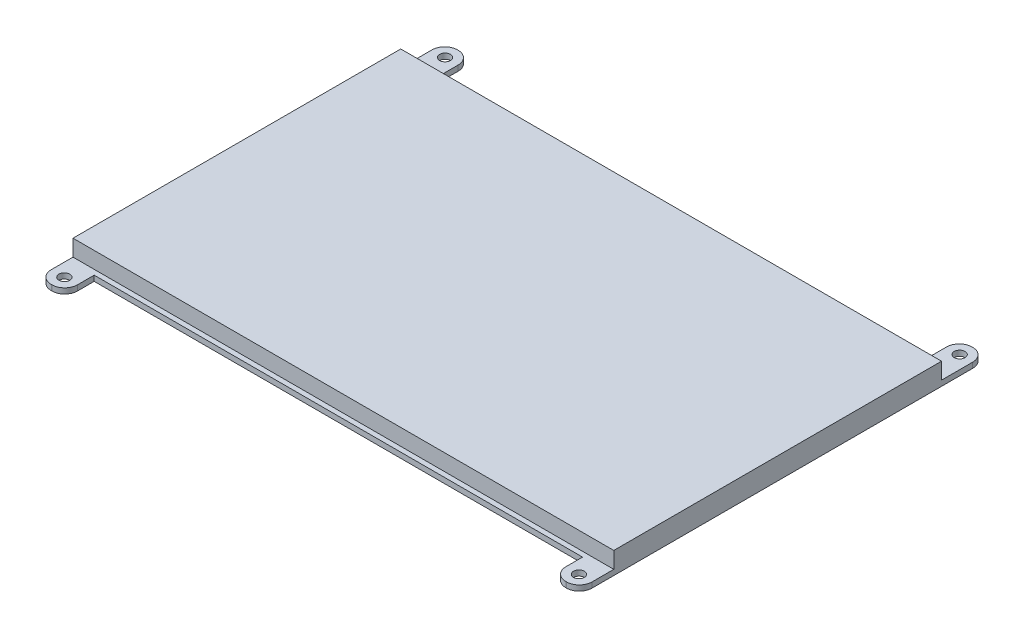
ISO-10303-21;
HEADER;
FILE_DESCRIPTION(('STEP AP214'),'2;1');
FILE_NAME('part.step','',(''),(''),'','','');
FILE_SCHEMA(('AUTOMOTIVE_DESIGN { 1 0 10303 214 1 1 1 1 }'));
ENDSEC;
DATA;
#1=APPLICATION_CONTEXT('core data for automotive mechanical design processes');
#2=APPLICATION_PROTOCOL_DEFINITION('international standard','automotive_design',2000,#1);
#3=PRODUCT_CONTEXT('',#1,'mechanical');
#4=PRODUCT('Part','Part','',(#3));
#5=PRODUCT_RELATED_PRODUCT_CATEGORY('part','',(#4));
#6=PRODUCT_DEFINITION_FORMATION('','',#4);
#7=PRODUCT_DEFINITION_CONTEXT('part definition',#1,'design');
#8=PRODUCT_DEFINITION('design','',#6,#7);
#9=PRODUCT_DEFINITION_SHAPE('','',#8);
#10=(LENGTH_UNIT() NAMED_UNIT(*) SI_UNIT(.MILLI.,.METRE.));
#11=(NAMED_UNIT(*) PLANE_ANGLE_UNIT() SI_UNIT($,.RADIAN.));
#12=(NAMED_UNIT(*) SI_UNIT($,.STERADIAN.) SOLID_ANGLE_UNIT());
#13=UNCERTAINTY_MEASURE_WITH_UNIT(LENGTH_MEASURE(1.E-05),#10,'distance_accuracy_value','');
#14=(GEOMETRIC_REPRESENTATION_CONTEXT(3) GLOBAL_UNCERTAINTY_ASSIGNED_CONTEXT((#13)) GLOBAL_UNIT_ASSIGNED_CONTEXT((#10,
#11,#12)) REPRESENTATION_CONTEXT('',''));
#15=CARTESIAN_POINT('',(0.,0.,0.));
#16=DIRECTION('',(0.,0.,1.));
#17=DIRECTION('',(1.,0.,0.));
#18=AXIS2_PLACEMENT_3D('',#15,#16,#17);
#19=CARTESIAN_POINT('',(-73.7209302325582,5.,-49.9999999999972));
#20=DIRECTION('',(1.,0.,0.));
#21=DIRECTION('',(0.,0.,-1.));
#22=AXIS2_PLACEMENT_3D('',#19,#20,#21);
#23=PLANE('',#22);
#24=DIRECTION('',(0.,-1.,0.));
#25=VECTOR('',#24,1.);
#26=CARTESIAN_POINT('',(-73.7209302325582,5.,-49.9999999999972));
#27=LINE('',#26,#25);
#28=CARTESIAN_POINT('',(-73.7209302325582,5.,-49.9999999999972));
#29=VERTEX_POINT('',#28);
#30=CARTESIAN_POINT('',(-73.7209302325581,0.,-49.9999999999972));
#31=VERTEX_POINT('',#30);
#32=EDGE_CURVE('E247',#29,#31,#27,.T.);
#33=ORIENTED_EDGE('',*,*,#32,.T.);
#34=DIRECTION('',(0.,0.,1.));
#35=VECTOR('',#34,1.);
#36=CARTESIAN_POINT('',(-73.7209302325581,0.,0.));
#37=LINE('',#36,#35);
#38=CARTESIAN_POINT('',(-73.7209302325582,0.,-59.5199999999971));
#39=VERTEX_POINT('',#38);
#40=EDGE_CURVE('E273',#39,#31,#37,.T.);
#41=ORIENTED_EDGE('',*,*,#40,.F.);
#42=DIRECTION('',(0.,1.,0.));
#43=VECTOR('',#42,1.);
#44=CARTESIAN_POINT('',(-73.7209302325582,-1.65,-59.5199999999971));
#45=LINE('',#44,#43);
#46=CARTESIAN_POINT('',(-73.7209302325582,-1.65,-59.5199999999971));
#47=VERTEX_POINT('',#46);
#48=EDGE_CURVE('E335',#47,#39,#45,.T.);
#49=ORIENTED_EDGE('',*,*,#48,.F.);
#50=DIRECTION('',(0.,0.,1.));
#51=VECTOR('',#50,1.);
#52=CARTESIAN_POINT('',(-73.7209302325581,-1.65,0.));
#53=LINE('',#52,#51);
#54=CARTESIAN_POINT('',(-73.7209302325581,-1.65,56.6300000000028));
#55=VERTEX_POINT('',#54);
#56=EDGE_CURVE('E419',#47,#55,#53,.T.);
#57=ORIENTED_EDGE('',*,*,#56,.T.);
#58=DIRECTION('',(0.,1.,0.));
#59=VECTOR('',#58,1.);
#60=CARTESIAN_POINT('',(-73.7209302325581,-1.65,56.6300000000028));
#61=LINE('',#60,#59);
#62=CARTESIAN_POINT('',(-73.7209302325581,0.,56.6300000000028));
#63=VERTEX_POINT('',#62);
#64=EDGE_CURVE('E271',#55,#63,#61,.T.);
#65=ORIENTED_EDGE('',*,*,#64,.T.);
#66=CARTESIAN_POINT('',(-73.7209302325581,0.,50.0000000000028));
#67=VERTEX_POINT('',#66);
#68=EDGE_CURVE('E266',#67,#63,#37,.T.);
#69=ORIENTED_EDGE('',*,*,#68,.F.);
#70=DIRECTION('',(0.,-1.,0.));
#71=VECTOR('',#70,1.);
#72=CARTESIAN_POINT('',(-73.7209302325581,5.,50.0000000000028));
#73=LINE('',#72,#71);
#74=CARTESIAN_POINT('',(-73.7209302325581,5.,50.0000000000028));
#75=VERTEX_POINT('',#74);
#76=EDGE_CURVE('E11',#75,#67,#73,.T.);
#77=ORIENTED_EDGE('',*,*,#76,.F.);
#78=DIRECTION('',(0.,0.,1.));
#79=VECTOR('',#78,1.);
#80=CARTESIAN_POINT('',(-73.7209302325582,5.,-49.9999999999972));
#81=LINE('',#80,#79);
#82=EDGE_CURVE('E241',#29,#75,#81,.T.);
#83=ORIENTED_EDGE('',*,*,#82,.F.);
#84=EDGE_LOOP('',(#33,#41,#49,#57,#65,#69,#77,#83));
#85=FACE_BOUND('',#84,.T.);
#86=ADVANCED_FACE('F49',(#85),#23,.F.);
#87=CARTESIAN_POINT('',(-73.7209302325581,5.,50.0000000000028));
#88=DIRECTION('',(0.,0.,-1.));
#89=DIRECTION('',(-1.,0.,0.));
#90=AXIS2_PLACEMENT_3D('',#87,#88,#89);
#91=PLANE('',#90);
#92=DIRECTION('',(1.,0.,0.));
#93=VECTOR('',#92,1.);
#94=CARTESIAN_POINT('',(-73.7209302325581,0.,50.0000000000028));
#95=LINE('',#94,#93);
#96=CARTESIAN_POINT('',(91.2790697674419,0.,50.0000000000028));
#97=VERTEX_POINT('',#96);
#98=EDGE_CURVE('E232',#67,#97,#95,.T.);
#99=ORIENTED_EDGE('',*,*,#98,.T.);
#100=DIRECTION('',(0.,-1.,0.));
#101=VECTOR('',#100,1.);
#102=CARTESIAN_POINT('',(91.2790697674419,5.,50.0000000000028));
#103=LINE('',#102,#101);
#104=CARTESIAN_POINT('',(91.2790697674419,5.,50.0000000000028));
#105=VERTEX_POINT('',#104);
#106=EDGE_CURVE('E57',#105,#97,#103,.T.);
#107=ORIENTED_EDGE('',*,*,#106,.F.);
#108=DIRECTION('',(1.,0.,0.));
#109=VECTOR('',#108,1.);
#110=CARTESIAN_POINT('',(-73.7209302325581,5.,50.0000000000028));
#111=LINE('',#110,#109);
#112=EDGE_CURVE('E243',#75,#105,#111,.T.);
#113=ORIENTED_EDGE('',*,*,#112,.F.);
#114=ORIENTED_EDGE('',*,*,#76,.T.);
#115=EDGE_LOOP('',(#99,#107,#113,#114));
#116=FACE_BOUND('',#115,.T.);
#117=ADVANCED_FACE('F259',(#116),#91,.F.);
#118=CARTESIAN_POINT('',(91.2790697674419,5.,-49.9999999999972));
#119=DIRECTION('',(-1.,0.,0.));
#120=DIRECTION('',(0.,0.,1.));
#121=AXIS2_PLACEMENT_3D('',#118,#119,#120);
#122=PLANE('',#121);
#123=ORIENTED_EDGE('',*,*,#106,.T.);
#124=DIRECTION('',(0.,0.,1.));
#125=VECTOR('',#124,1.);
#126=CARTESIAN_POINT('',(91.2790697674419,0.,0.));
#127=LINE('',#126,#125);
#128=CARTESIAN_POINT('',(91.2790697674419,0.,56.6300000000028));
#129=VERTEX_POINT('',#128);
#130=EDGE_CURVE('E230',#97,#129,#127,.T.);
#131=ORIENTED_EDGE('',*,*,#130,.T.);
#132=DIRECTION('',(0.,1.,0.));
#133=VECTOR('',#132,1.);
#134=CARTESIAN_POINT('',(91.2790697674419,-1.65,56.6300000000028));
#135=LINE('',#134,#133);
#136=CARTESIAN_POINT('',(91.2790697674419,-1.65,56.6300000000028));
#137=VERTEX_POINT('',#136);
#138=EDGE_CURVE('E209',#137,#129,#135,.T.);
#139=ORIENTED_EDGE('',*,*,#138,.F.);
#140=DIRECTION('',(0.,0.,1.));
#141=VECTOR('',#140,1.);
#142=CARTESIAN_POINT('',(91.2790697674419,-1.65,0.));
#143=LINE('',#142,#141);
#144=CARTESIAN_POINT('',(91.2790697674419,-1.65,-59.5199999999971));
#145=VERTEX_POINT('',#144);
#146=EDGE_CURVE('E215',#145,#137,#143,.T.);
#147=ORIENTED_EDGE('',*,*,#146,.F.);
#148=DIRECTION('',(0.,1.,0.));
#149=VECTOR('',#148,1.);
#150=CARTESIAN_POINT('',(91.2790697674419,-1.65,-59.5199999999971));
#151=LINE('',#150,#149);
#152=CARTESIAN_POINT('',(91.2790697674419,0.,-59.5199999999971));
#153=VERTEX_POINT('',#152);
#154=EDGE_CURVE('E314',#145,#153,#151,.T.);
#155=ORIENTED_EDGE('',*,*,#154,.T.);
#156=CARTESIAN_POINT('',(91.2790697674419,0.,-49.9999999999972));
#157=VERTEX_POINT('',#156);
#158=EDGE_CURVE('E453',#153,#157,#127,.T.);
#159=ORIENTED_EDGE('',*,*,#158,.T.);
#160=DIRECTION('',(0.,-1.,0.));
#161=VECTOR('',#160,1.);
#162=CARTESIAN_POINT('',(91.2790697674419,5.,-49.9999999999972));
#163=LINE('',#162,#161);
#164=CARTESIAN_POINT('',(91.2790697674419,5.,-49.9999999999972));
#165=VERTEX_POINT('',#164);
#166=EDGE_CURVE('E253',#165,#157,#163,.T.);
#167=ORIENTED_EDGE('',*,*,#166,.F.);
#168=DIRECTION('',(0.,0.,-1.));
#169=VECTOR('',#168,1.);
#170=CARTESIAN_POINT('',(91.2790697674419,5.,-49.9999999999972));
#171=LINE('',#170,#169);
#172=EDGE_CURVE('E245',#105,#165,#171,.T.);
#173=ORIENTED_EDGE('',*,*,#172,.F.);
#174=EDGE_LOOP('',(#123,#131,#139,#147,#155,#159,#167,#173));
#175=FACE_BOUND('',#174,.T.);
#176=ADVANCED_FACE('F228',(#175),#122,.F.);
#177=CARTESIAN_POINT('',(-73.7209302325582,5.,-49.9999999999972));
#178=DIRECTION('',(0.,0.,1.));
#179=DIRECTION('',(1.,0.,0.));
#180=AXIS2_PLACEMENT_3D('',#177,#178,#179);
#181=PLANE('',#180);
#182=DIRECTION('',(-1.,0.,0.));
#183=VECTOR('',#182,1.);
#184=CARTESIAN_POINT('',(-73.7209302325582,0.,-49.9999999999972));
#185=LINE('',#184,#183);
#186=EDGE_CURVE('E235',#157,#31,#185,.T.);
#187=ORIENTED_EDGE('',*,*,#186,.T.);
#188=ORIENTED_EDGE('',*,*,#32,.F.);
#189=DIRECTION('',(-1.,0.,0.));
#190=VECTOR('',#189,1.);
#191=CARTESIAN_POINT('',(-73.7209302325582,5.,-49.9999999999972));
#192=LINE('',#191,#190);
#193=EDGE_CURVE('E64',#165,#29,#192,.T.);
#194=ORIENTED_EDGE('',*,*,#193,.F.);
#195=ORIENTED_EDGE('',*,*,#166,.T.);
#196=EDGE_LOOP('',(#187,#188,#194,#195));
#197=FACE_BOUND('',#196,.T.);
#198=ADVANCED_FACE('F481',(#197),#181,.F.);
#199=CARTESIAN_POINT('',(0.,5.,0.));
#200=DIRECTION('',(0.,1.,0.));
#201=DIRECTION('',(0.,0.,1.));
#202=AXIS2_PLACEMENT_3D('',#199,#200,#201);
#203=PLANE('',#202);
#204=ORIENTED_EDGE('',*,*,#82,.T.);
#205=ORIENTED_EDGE('',*,*,#112,.T.);
#206=ORIENTED_EDGE('',*,*,#172,.T.);
#207=ORIENTED_EDGE('',*,*,#193,.T.);
#208=EDGE_LOOP('',(#204,#205,#206,#207));
#209=FACE_BOUND('',#208,.T.);
#210=ADVANCED_FACE('F486',(#209),#203,.T.);
#211=CARTESIAN_POINT('',(0.,0.,0.));
#212=DIRECTION('',(0.,-1.,0.));
#213=DIRECTION('',(0.,0.,-1.));
#214=AXIS2_PLACEMENT_3D('',#211,#212,#213);
#215=PLANE('',#214);
#216=ORIENTED_EDGE('',*,*,#186,.F.);
#217=ORIENTED_EDGE('',*,*,#158,.F.);
#218=CARTESIAN_POINT('',(87.3790697674418,0.,-59.5199999999972));
#219=DIRECTION('',(0.,-1.,0.));
#220=DIRECTION('',(0.,0.,-1.));
#221=AXIS2_PLACEMENT_3D('',#218,#219,#220);
#222=CIRCLE('',#221,3.9);
#223=CARTESIAN_POINT('',(87.3790697674418,0.,-63.4199999999972));
#224=VERTEX_POINT('',#223);
#225=EDGE_CURVE('E302',#153,#224,#222,.F.);
#226=ORIENTED_EDGE('',*,*,#225,.T.);
#227=DIRECTION('',(-1.,0.,0.));
#228=VECTOR('',#227,1.);
#229=CARTESIAN_POINT('',(0.,0.,-63.4199999999972));
#230=LINE('',#229,#228);
#231=CARTESIAN_POINT('',(87.1790697674419,0.,-63.4199999999972));
#232=VERTEX_POINT('',#231);
#233=EDGE_CURVE('E299',#224,#232,#230,.T.);
#234=ORIENTED_EDGE('',*,*,#233,.T.);
#235=CARTESIAN_POINT('',(87.1790697674418,0.,-59.5199999999972));
#236=DIRECTION('',(0.,-1.,0.));
#237=DIRECTION('',(0.,0.,-1.));
#238=AXIS2_PLACEMENT_3D('',#235,#236,#237);
#239=CIRCLE('',#238,3.9);
#240=CARTESIAN_POINT('',(83.2790697674418,0.,-59.5199999999971));
#241=VERTEX_POINT('',#240);
#242=EDGE_CURVE('E296',#232,#241,#239,.F.);
#243=ORIENTED_EDGE('',*,*,#242,.T.);
#244=DIRECTION('',(0.,0.,-1.));
#245=VECTOR('',#244,1.);
#246=CARTESIAN_POINT('',(83.2790697674418,0.,0.));
#247=LINE('',#246,#245);
#248=CARTESIAN_POINT('',(83.2790697674418,0.,-54.4199999999972));
#249=VERTEX_POINT('',#248);
#250=EDGE_CURVE('E293',#249,#241,#247,.T.);
#251=ORIENTED_EDGE('',*,*,#250,.F.);
#252=DIRECTION('',(-1.,0.,0.));
#253=VECTOR('',#252,1.);
#254=CARTESIAN_POINT('',(0.,0.,-54.4199999999972));
#255=LINE('',#254,#253);
#256=CARTESIAN_POINT('',(-65.7209302325582,0.,-54.4199999999972));
#257=VERTEX_POINT('',#256);
#258=EDGE_CURVE('E290',#249,#257,#255,.T.);
#259=ORIENTED_EDGE('',*,*,#258,.T.);
#260=DIRECTION('',(0.,0.,-1.));
#261=VECTOR('',#260,1.);
#262=CARTESIAN_POINT('',(-65.7209302325583,0.,-1.78835514568555E-13));
#263=LINE('',#262,#261);
#264=CARTESIAN_POINT('',(-65.7209302325581,0.,-59.5199999999971));
#265=VERTEX_POINT('',#264);
#266=EDGE_CURVE('E287',#257,#265,#263,.T.);
#267=ORIENTED_EDGE('',*,*,#266,.T.);
#268=CARTESIAN_POINT('',(-69.6209302325582,0.,-59.5199999999972));
#269=DIRECTION('',(0.,-1.,0.));
#270=DIRECTION('',(0.,0.,-1.));
#271=AXIS2_PLACEMENT_3D('',#268,#269,#270);
#272=CIRCLE('',#271,3.9);
#273=CARTESIAN_POINT('',(-69.6209302325582,0.,-63.4199999999972));
#274=VERTEX_POINT('',#273);
#275=EDGE_CURVE('E284',#274,#265,#272,.T.);
#276=ORIENTED_EDGE('',*,*,#275,.F.);
#277=DIRECTION('',(1.,0.,0.));
#278=VECTOR('',#277,1.);
#279=CARTESIAN_POINT('',(0.,0.,-63.4199999999972));
#280=LINE('',#279,#278);
#281=CARTESIAN_POINT('',(-69.8209302325581,0.,-63.4199999999972));
#282=VERTEX_POINT('',#281);
#283=EDGE_CURVE('E282',#282,#274,#280,.T.);
#284=ORIENTED_EDGE('',*,*,#283,.F.);
#285=CARTESIAN_POINT('',(-69.8209302325582,0.,-59.5199999999972));
#286=DIRECTION('',(0.,-1.,0.));
#287=DIRECTION('',(0.,0.,-1.));
#288=AXIS2_PLACEMENT_3D('',#285,#286,#287);
#289=CIRCLE('',#288,3.9);
#290=EDGE_CURVE('E276',#39,#282,#289,.T.);
#291=ORIENTED_EDGE('',*,*,#290,.F.);
#292=ORIENTED_EDGE('',*,*,#40,.T.);
#293=EDGE_LOOP('',(#216,#217,#226,#234,#243,#251,#259,#267,#276,#284,#291,#292));
#294=FACE_BOUND('',#293,.T.);
#295=CARTESIAN_POINT('',(87.2790697674419,0.,-59.5199999999972));
#296=DIRECTION('',(0.,-1.,0.));
#297=DIRECTION('',(0.,0.,-1.));
#298=AXIS2_PLACEMENT_3D('',#295,#296,#297);
#299=CIRCLE('',#298,1.65);
#300=CARTESIAN_POINT('',(87.2790697674419,0.,-61.1699999999972));
#301=VERTEX_POINT('',#300);
#302=EDGE_CURVE('E311',#301,#301,#299,.T.);
#303=ORIENTED_EDGE('',*,*,#302,.T.);
#304=EDGE_LOOP('',(#303));
#305=FACE_BOUND('',#304,.T.);
#306=CARTESIAN_POINT('',(-69.7209302325582,0.,-59.5199999999972));
#307=DIRECTION('',(0.,-1.,0.));
#308=DIRECTION('',(0.,0.,-1.));
#309=AXIS2_PLACEMENT_3D('',#306,#307,#308);
#310=CIRCLE('',#309,1.65);
#311=CARTESIAN_POINT('',(-69.7209302325582,0.,-61.1699999999972));
#312=VERTEX_POINT('',#311);
#313=EDGE_CURVE('E308',#312,#312,#310,.T.);
#314=ORIENTED_EDGE('',*,*,#313,.T.);
#315=EDGE_LOOP('',(#314));
#316=FACE_BOUND('',#315,.T.);
#317=ADVANCED_FACE('F471',(#294,#305,#316),#215,.F.);
#318=CARTESIAN_POINT('',(87.3790697674418,-1.65,56.6300000000029));
#319=DIRECTION('',(0.,1.,0.));
#320=DIRECTION('',(0.,0.,1.));
#321=AXIS2_PLACEMENT_3D('',#318,#319,#320);
#322=CYLINDRICAL_SURFACE('',#321,3.9);
#323=CARTESIAN_POINT('',(87.3790697674418,0.,56.6300000000029));
#324=DIRECTION('',(0.,-1.,0.));
#325=DIRECTION('',(0.,0.,-1.));
#326=AXIS2_PLACEMENT_3D('',#323,#324,#325);
#327=CIRCLE('',#326,3.9);
#328=CARTESIAN_POINT('',(87.3790697674418,0.,60.5300000000029));
#329=VERTEX_POINT('',#328);
#330=EDGE_CURVE('E370',#129,#329,#327,.T.);
#331=ORIENTED_EDGE('',*,*,#330,.T.);
#332=DIRECTION('',(0.,1.,0.));
#333=VECTOR('',#332,1.);
#334=CARTESIAN_POINT('',(87.3790697674418,-1.65,60.5300000000029));
#335=LINE('',#334,#333);
#336=CARTESIAN_POINT('',(87.3790697674418,-1.65,60.5300000000029));
#337=VERTEX_POINT('',#336);
#338=EDGE_CURVE('E211',#337,#329,#335,.T.);
#339=ORIENTED_EDGE('',*,*,#338,.F.);
#340=CARTESIAN_POINT('',(87.3790697674418,-1.65,56.6300000000029));
#341=DIRECTION('',(0.,-1.,0.));
#342=DIRECTION('',(0.,0.,-1.));
#343=AXIS2_PLACEMENT_3D('',#340,#341,#342);
#344=CIRCLE('',#343,3.9);
#345=EDGE_CURVE('E205',#137,#337,#344,.T.);
#346=ORIENTED_EDGE('',*,*,#345,.F.);
#347=ORIENTED_EDGE('',*,*,#138,.T.);
#348=EDGE_LOOP('',(#331,#339,#346,#347));
#349=FACE_BOUND('',#348,.T.);
#350=ADVANCED_FACE('F207',(#349),#322,.T.);
#351=CARTESIAN_POINT('',(0.,-1.65,60.5300000000029));
#352=DIRECTION('',(0.,0.,-1.));
#353=DIRECTION('',(-1.,0.,0.));
#354=AXIS2_PLACEMENT_3D('',#351,#352,#353);
#355=PLANE('',#354);
#356=DIRECTION('',(-1.,0.,0.));
#357=VECTOR('',#356,1.);
#358=CARTESIAN_POINT('',(0.,0.,60.5300000000029));
#359=LINE('',#358,#357);
#360=CARTESIAN_POINT('',(87.1790697674419,0.,60.5300000000029));
#361=VERTEX_POINT('',#360);
#362=EDGE_CURVE('E363',#329,#361,#359,.T.);
#363=ORIENTED_EDGE('',*,*,#362,.T.);
#364=DIRECTION('',(0.,1.,0.));
#365=VECTOR('',#364,1.);
#366=CARTESIAN_POINT('',(87.1790697674419,-1.65,60.5300000000029));
#367=LINE('',#366,#365);
#368=CARTESIAN_POINT('',(87.1790697674419,-1.65,60.5300000000029));
#369=VERTEX_POINT('',#368);
#370=EDGE_CURVE('E237',#369,#361,#367,.T.);
#371=ORIENTED_EDGE('',*,*,#370,.F.);
#372=DIRECTION('',(-1.,0.,0.));
#373=VECTOR('',#372,1.);
#374=CARTESIAN_POINT('',(0.,-1.65,60.5300000000029));
#375=LINE('',#374,#373);
#376=EDGE_CURVE('E214',#337,#369,#375,.T.);
#377=ORIENTED_EDGE('',*,*,#376,.F.);
#378=ORIENTED_EDGE('',*,*,#338,.T.);
#379=EDGE_LOOP('',(#363,#371,#377,#378));
#380=FACE_BOUND('',#379,.T.);
#381=ADVANCED_FACE('F455',(#380),#355,.F.);
#382=CARTESIAN_POINT('',(87.1790697674418,-1.65,56.6300000000029));
#383=DIRECTION('',(0.,1.,0.));
#384=DIRECTION('',(0.,0.,1.));
#385=AXIS2_PLACEMENT_3D('',#382,#383,#384);
#386=CYLINDRICAL_SURFACE('',#385,3.9);
#387=CARTESIAN_POINT('',(87.1790697674418,0.,56.6300000000029));
#388=DIRECTION('',(0.,-1.,0.));
#389=DIRECTION('',(0.,0.,-1.));
#390=AXIS2_PLACEMENT_3D('',#387,#388,#389);
#391=CIRCLE('',#390,3.9);
#392=CARTESIAN_POINT('',(83.2790697674418,0.,56.6300000000028));
#393=VERTEX_POINT('',#392);
#394=EDGE_CURVE('E358',#361,#393,#391,.T.);
#395=ORIENTED_EDGE('',*,*,#394,.T.);
#396=DIRECTION('',(0.,1.,0.));
#397=VECTOR('',#396,1.);
#398=CARTESIAN_POINT('',(83.2790697674418,-1.65,56.6300000000028));
#399=LINE('',#398,#397);
#400=CARTESIAN_POINT('',(83.2790697674418,-1.65,56.6300000000028));
#401=VERTEX_POINT('',#400);
#402=EDGE_CURVE('E349',#401,#393,#399,.T.);
#403=ORIENTED_EDGE('',*,*,#402,.F.);
#404=CARTESIAN_POINT('',(87.1790697674418,-1.65,56.6300000000029));
#405=DIRECTION('',(0.,-1.,0.));
#406=DIRECTION('',(0.,0.,-1.));
#407=AXIS2_PLACEMENT_3D('',#404,#405,#406);
#408=CIRCLE('',#407,3.9);
#409=EDGE_CURVE('E360',#369,#401,#408,.T.);
#410=ORIENTED_EDGE('',*,*,#409,.F.);
#411=ORIENTED_EDGE('',*,*,#370,.T.);
#412=EDGE_LOOP('',(#395,#403,#410,#411));
#413=FACE_BOUND('',#412,.T.);
#414=ADVANCED_FACE('F356',(#413),#386,.T.);
#415=CARTESIAN_POINT('',(83.2790697674418,-1.65,0.));
#416=DIRECTION('',(-1.,0.,0.));
#417=DIRECTION('',(0.,0.,1.));
#418=AXIS2_PLACEMENT_3D('',#415,#416,#417);
#419=PLANE('',#418);
#420=DIRECTION('',(0.,0.,1.));
#421=VECTOR('',#420,1.);
#422=CARTESIAN_POINT('',(83.2790697674418,0.,0.));
#423=LINE('',#422,#421);
#424=CARTESIAN_POINT('',(83.2790697674418,0.,51.5300000000029));
#425=VERTEX_POINT('',#424);
#426=EDGE_CURVE('E366',#425,#393,#423,.T.);
#427=ORIENTED_EDGE('',*,*,#426,.F.);
#428=DIRECTION('',(0.,1.,0.));
#429=VECTOR('',#428,1.);
#430=CARTESIAN_POINT('',(83.2790697674418,-1.65,51.5300000000029));
#431=LINE('',#430,#429);
#432=CARTESIAN_POINT('',(83.2790697674418,-1.65,51.5300000000029));
#433=VERTEX_POINT('',#432);
#434=EDGE_CURVE('E347',#433,#425,#431,.T.);
#435=ORIENTED_EDGE('',*,*,#434,.F.);
#436=DIRECTION('',(0.,0.,1.));
#437=VECTOR('',#436,1.);
#438=CARTESIAN_POINT('',(83.2790697674418,-1.65,0.));
#439=LINE('',#438,#437);
#440=EDGE_CURVE('E405',#433,#401,#439,.T.);
#441=ORIENTED_EDGE('',*,*,#440,.T.);
#442=ORIENTED_EDGE('',*,*,#402,.T.);
#443=EDGE_LOOP('',(#427,#435,#441,#442));
#444=FACE_BOUND('',#443,.T.);
#445=ADVANCED_FACE('F401',(#444),#419,.T.);
#446=CARTESIAN_POINT('',(0.,-1.65,51.5300000000029));
#447=DIRECTION('',(0.,0.,-1.));
#448=DIRECTION('',(-1.,0.,0.));
#449=AXIS2_PLACEMENT_3D('',#446,#447,#448);
#450=PLANE('',#449);
#451=DIRECTION('',(-1.,0.,0.));
#452=VECTOR('',#451,1.);
#453=CARTESIAN_POINT('',(0.,0.,51.5300000000029));
#454=LINE('',#453,#452);
#455=CARTESIAN_POINT('',(-65.7209302325581,0.,51.5300000000029));
#456=VERTEX_POINT('',#455);
#457=EDGE_CURVE('E368',#425,#456,#454,.T.);
#458=ORIENTED_EDGE('',*,*,#457,.T.);
#459=DIRECTION('',(0.,1.,0.));
#460=VECTOR('',#459,1.);
#461=CARTESIAN_POINT('',(-65.7209302325581,-1.65,51.5300000000029));
#462=LINE('',#461,#460);
#463=CARTESIAN_POINT('',(-65.7209302325581,-1.65,51.5300000000029));
#464=VERTEX_POINT('',#463);
#465=EDGE_CURVE('E344',#464,#456,#462,.T.);
#466=ORIENTED_EDGE('',*,*,#465,.F.);
#467=DIRECTION('',(-1.,0.,0.));
#468=VECTOR('',#467,1.);
#469=CARTESIAN_POINT('',(0.,-1.65,51.5300000000029));
#470=LINE('',#469,#468);
#471=EDGE_CURVE('E406',#433,#464,#470,.T.);
#472=ORIENTED_EDGE('',*,*,#471,.F.);
#473=ORIENTED_EDGE('',*,*,#434,.T.);
#474=EDGE_LOOP('',(#458,#466,#472,#473));
#475=FACE_BOUND('',#474,.T.);
#476=ADVANCED_FACE('F501',(#475),#450,.F.);
#477=CARTESIAN_POINT('',(-65.7209302325581,-1.65,0.));
#478=DIRECTION('',(-1.,0.,0.));
#479=DIRECTION('',(0.,0.,1.));
#480=AXIS2_PLACEMENT_3D('',#477,#478,#479);
#481=PLANE('',#480);
#482=DIRECTION('',(0.,0.,1.));
#483=VECTOR('',#482,1.);
#484=CARTESIAN_POINT('',(-65.7209302325581,0.,0.));
#485=LINE('',#484,#483);
#486=CARTESIAN_POINT('',(-65.7209302325581,0.,56.6300000000028));
#487=VERTEX_POINT('',#486);
#488=EDGE_CURVE('E375',#456,#487,#485,.T.);
#489=ORIENTED_EDGE('',*,*,#488,.T.);
#490=DIRECTION('',(0.,1.,0.));
#491=VECTOR('',#490,1.);
#492=CARTESIAN_POINT('',(-65.7209302325581,-1.65,56.6300000000028));
#493=LINE('',#492,#491);
#494=CARTESIAN_POINT('',(-65.7209302325581,-1.65,56.6300000000028));
#495=VERTEX_POINT('',#494);
#496=EDGE_CURVE('E342',#495,#487,#493,.T.);
#497=ORIENTED_EDGE('',*,*,#496,.F.);
#498=DIRECTION('',(0.,0.,1.));
#499=VECTOR('',#498,1.);
#500=CARTESIAN_POINT('',(-65.7209302325581,-1.65,0.));
#501=LINE('',#500,#499);
#502=EDGE_CURVE('E408',#464,#495,#501,.T.);
#503=ORIENTED_EDGE('',*,*,#502,.F.);
#504=ORIENTED_EDGE('',*,*,#465,.T.);
#505=EDGE_LOOP('',(#489,#497,#503,#504));
#506=FACE_BOUND('',#505,.T.);
#507=ADVANCED_FACE('F397',(#506),#481,.F.);
#508=CARTESIAN_POINT('',(-69.6209302325582,-1.65,56.6300000000029));
#509=DIRECTION('',(0.,1.,0.));
#510=DIRECTION('',(0.,0.,1.));
#511=AXIS2_PLACEMENT_3D('',#508,#509,#510);
#512=CYLINDRICAL_SURFACE('',#511,3.9);
#513=CARTESIAN_POINT('',(-69.6209302325582,0.,56.6300000000029));
#514=DIRECTION('',(0.,-1.,0.));
#515=DIRECTION('',(0.,0.,-1.));
#516=AXIS2_PLACEMENT_3D('',#513,#514,#515);
#517=CIRCLE('',#516,3.9);
#518=CARTESIAN_POINT('',(-69.6209302325582,0.,60.5300000000029));
#519=VERTEX_POINT('',#518);
#520=EDGE_CURVE('E378',#519,#487,#517,.F.);
#521=ORIENTED_EDGE('',*,*,#520,.F.);
#522=DIRECTION('',(0.,1.,0.));
#523=VECTOR('',#522,1.);
#524=CARTESIAN_POINT('',(-69.6209302325582,-1.65,60.5300000000029));
#525=LINE('',#524,#523);
#526=CARTESIAN_POINT('',(-69.6209302325582,-1.65,60.5300000000029));
#527=VERTEX_POINT('',#526);
#528=EDGE_CURVE('E340',#527,#519,#525,.T.);
#529=ORIENTED_EDGE('',*,*,#528,.F.);
#530=CARTESIAN_POINT('',(-69.6209302325582,-1.65,56.6300000000029));
#531=DIRECTION('',(0.,-1.,0.));
#532=DIRECTION('',(0.,0.,-1.));
#533=AXIS2_PLACEMENT_3D('',#530,#531,#532);
#534=CIRCLE('',#533,3.9);
#535=EDGE_CURVE('E394',#527,#495,#534,.F.);
#536=ORIENTED_EDGE('',*,*,#535,.T.);
#537=ORIENTED_EDGE('',*,*,#496,.T.);
#538=EDGE_LOOP('',(#521,#529,#536,#537));
#539=FACE_BOUND('',#538,.T.);
#540=ADVANCED_FACE('F392',(#539),#512,.T.);
#541=CARTESIAN_POINT('',(0.,-1.65,60.5300000000029));
#542=DIRECTION('',(0.,0.,1.));
#543=DIRECTION('',(1.,0.,0.));
#544=AXIS2_PLACEMENT_3D('',#541,#542,#543);
#545=PLANE('',#544);
#546=DIRECTION('',(1.,0.,0.));
#547=VECTOR('',#546,1.);
#548=CARTESIAN_POINT('',(0.,0.,60.5300000000029));
#549=LINE('',#548,#547);
#550=CARTESIAN_POINT('',(-69.8209302325581,0.,60.5300000000029));
#551=VERTEX_POINT('',#550);
#552=EDGE_CURVE('E277',#551,#519,#549,.T.);
#553=ORIENTED_EDGE('',*,*,#552,.F.);
#554=DIRECTION('',(0.,1.,0.));
#555=VECTOR('',#554,1.);
#556=CARTESIAN_POINT('',(-69.8209302325581,-1.65,60.5300000000029));
#557=LINE('',#556,#555);
#558=CARTESIAN_POINT('',(-69.8209302325581,-1.65,60.5300000000029));
#559=VERTEX_POINT('',#558);
#560=EDGE_CURVE('E338',#559,#551,#557,.T.);
#561=ORIENTED_EDGE('',*,*,#560,.F.);
#562=DIRECTION('',(1.,0.,0.));
#563=VECTOR('',#562,1.);
#564=CARTESIAN_POINT('',(0.,-1.65,60.5300000000029));
#565=LINE('',#564,#563);
#566=EDGE_CURVE('E388',#559,#527,#565,.T.);
#567=ORIENTED_EDGE('',*,*,#566,.T.);
#568=ORIENTED_EDGE('',*,*,#528,.T.);
#569=EDGE_LOOP('',(#553,#561,#567,#568));
#570=FACE_BOUND('',#569,.T.);
#571=ADVANCED_FACE('F385',(#570),#545,.T.);
#572=CARTESIAN_POINT('',(-69.8209302325581,-1.65,56.6300000000029));
#573=DIRECTION('',(0.,1.,0.));
#574=DIRECTION('',(0.,0.,1.));
#575=AXIS2_PLACEMENT_3D('',#572,#573,#574);
#576=CYLINDRICAL_SURFACE('',#575,3.9);
#577=CARTESIAN_POINT('',(-69.8209302325581,0.,56.6300000000029));
#578=DIRECTION('',(0.,-1.,0.));
#579=DIRECTION('',(0.,0.,-1.));
#580=AXIS2_PLACEMENT_3D('',#577,#578,#579);
#581=CIRCLE('',#580,3.9);
#582=EDGE_CURVE('E274',#63,#551,#581,.F.);
#583=ORIENTED_EDGE('',*,*,#582,.F.);
#584=ORIENTED_EDGE('',*,*,#64,.F.);
#585=CARTESIAN_POINT('',(-69.8209302325581,-1.65,56.6300000000029));
#586=DIRECTION('',(0.,-1.,0.));
#587=DIRECTION('',(0.,0.,-1.));
#588=AXIS2_PLACEMENT_3D('',#585,#586,#587);
#589=CIRCLE('',#588,3.9);
#590=EDGE_CURVE('E416',#55,#559,#589,.F.);
#591=ORIENTED_EDGE('',*,*,#590,.T.);
#592=ORIENTED_EDGE('',*,*,#560,.T.);
#593=EDGE_LOOP('',(#583,#584,#591,#592));
#594=FACE_BOUND('',#593,.T.);
#595=ADVANCED_FACE('F510',(#594),#576,.T.);
#596=CARTESIAN_POINT('',(-69.8209302325582,-1.65,-59.5199999999972));
#597=DIRECTION('',(0.,1.,0.));
#598=DIRECTION('',(0.,0.,1.));
#599=AXIS2_PLACEMENT_3D('',#596,#597,#598);
#600=CYLINDRICAL_SURFACE('',#599,3.9);
#601=ORIENTED_EDGE('',*,*,#290,.T.);
#602=DIRECTION('',(0.,1.,0.));
#603=VECTOR('',#602,1.);
#604=CARTESIAN_POINT('',(-69.8209302325581,-1.65,-63.4199999999972));
#605=LINE('',#604,#603);
#606=CARTESIAN_POINT('',(-69.8209302325581,-1.65,-63.4199999999972));
#607=VERTEX_POINT('',#606);
#608=EDGE_CURVE('E332',#607,#282,#605,.T.);
#609=ORIENTED_EDGE('',*,*,#608,.F.);
#610=CARTESIAN_POINT('',(-69.8209302325582,-1.65,-59.5199999999972));
#611=DIRECTION('',(0.,-1.,0.));
#612=DIRECTION('',(0.,0.,-1.));
#613=AXIS2_PLACEMENT_3D('',#610,#611,#612);
#614=CIRCLE('',#613,3.9);
#615=EDGE_CURVE('E421',#47,#607,#614,.T.);
#616=ORIENTED_EDGE('',*,*,#615,.F.);
#617=ORIENTED_EDGE('',*,*,#48,.T.);
#618=EDGE_LOOP('',(#601,#609,#616,#617));
#619=FACE_BOUND('',#618,.T.);
#620=ADVANCED_FACE('F513',(#619),#600,.T.);
#621=CARTESIAN_POINT('',(0.,-1.65,-63.4199999999972));
#622=DIRECTION('',(0.,0.,1.));
#623=DIRECTION('',(1.,0.,0.));
#624=AXIS2_PLACEMENT_3D('',#621,#622,#623);
#625=PLANE('',#624);
#626=ORIENTED_EDGE('',*,*,#283,.T.);
#627=DIRECTION('',(0.,1.,0.));
#628=VECTOR('',#627,1.);
#629=CARTESIAN_POINT('',(-69.6209302325582,-1.65,-63.4199999999972));
#630=LINE('',#629,#628);
#631=CARTESIAN_POINT('',(-69.6209302325582,-1.65,-63.4199999999972));
#632=VERTEX_POINT('',#631);
#633=EDGE_CURVE('E329',#632,#274,#630,.T.);
#634=ORIENTED_EDGE('',*,*,#633,.F.);
#635=DIRECTION('',(1.,0.,0.));
#636=VECTOR('',#635,1.);
#637=CARTESIAN_POINT('',(0.,-1.65,-63.4199999999972));
#638=LINE('',#637,#636);
#639=EDGE_CURVE('E423',#607,#632,#638,.T.);
#640=ORIENTED_EDGE('',*,*,#639,.F.);
#641=ORIENTED_EDGE('',*,*,#608,.T.);
#642=EDGE_LOOP('',(#626,#634,#640,#641));
#643=FACE_BOUND('',#642,.T.);
#644=ADVANCED_FACE('F517',(#643),#625,.F.);
#645=CARTESIAN_POINT('',(-69.6209302325582,-1.65,-59.5199999999972));
#646=DIRECTION('',(0.,1.,0.));
#647=DIRECTION('',(0.,0.,1.));
#648=AXIS2_PLACEMENT_3D('',#645,#646,#647);
#649=CYLINDRICAL_SURFACE('',#648,3.9);
#650=ORIENTED_EDGE('',*,*,#275,.T.);
#651=DIRECTION('',(0.,1.,0.));
#652=VECTOR('',#651,1.);
#653=CARTESIAN_POINT('',(-65.7209302325581,-1.65,-59.5199999999971));
#654=LINE('',#653,#652);
#655=CARTESIAN_POINT('',(-65.7209302325581,-1.65,-59.5199999999971));
#656=VERTEX_POINT('',#655);
#657=EDGE_CURVE('E327',#656,#265,#654,.T.);
#658=ORIENTED_EDGE('',*,*,#657,.F.);
#659=CARTESIAN_POINT('',(-69.6209302325582,-1.65,-59.5199999999972));
#660=DIRECTION('',(0.,-1.,0.));
#661=DIRECTION('',(0.,0.,-1.));
#662=AXIS2_PLACEMENT_3D('',#659,#660,#661);
#663=CIRCLE('',#662,3.9);
#664=EDGE_CURVE('E425',#632,#656,#663,.T.);
#665=ORIENTED_EDGE('',*,*,#664,.F.);
#666=ORIENTED_EDGE('',*,*,#633,.T.);
#667=EDGE_LOOP('',(#650,#658,#665,#666));
#668=FACE_BOUND('',#667,.T.);
#669=ADVANCED_FACE('F521',(#668),#649,.T.);
#670=CARTESIAN_POINT('',(-65.7209302325583,-1.65,-1.78835514568555E-13));
#671=DIRECTION('',(1.,0.,0.));
#672=DIRECTION('',(0.,0.,-1.));
#673=AXIS2_PLACEMENT_3D('',#670,#671,#672);
#674=PLANE('',#673);
#675=ORIENTED_EDGE('',*,*,#266,.F.);
#676=DIRECTION('',(0.,1.,0.));
#677=VECTOR('',#676,1.);
#678=CARTESIAN_POINT('',(-65.7209302325582,-1.65,-54.4199999999972));
#679=LINE('',#678,#677);
#680=CARTESIAN_POINT('',(-65.7209302325582,-1.65,-54.4199999999972));
#681=VERTEX_POINT('',#680);
#682=EDGE_CURVE('E325',#681,#257,#679,.T.);
#683=ORIENTED_EDGE('',*,*,#682,.F.);
#684=DIRECTION('',(0.,0.,-1.));
#685=VECTOR('',#684,1.);
#686=CARTESIAN_POINT('',(-65.7209302325583,-1.65,-1.78835514568555E-13));
#687=LINE('',#686,#685);
#688=EDGE_CURVE('E427',#681,#656,#687,.T.);
#689=ORIENTED_EDGE('',*,*,#688,.T.);
#690=ORIENTED_EDGE('',*,*,#657,.T.);
#691=EDGE_LOOP('',(#675,#683,#689,#690));
#692=FACE_BOUND('',#691,.T.);
#693=ADVANCED_FACE('F525',(#692),#674,.T.);
#694=CARTESIAN_POINT('',(0.,-1.65,-54.4199999999972));
#695=DIRECTION('',(0.,0.,-1.));
#696=DIRECTION('',(-1.,0.,0.));
#697=AXIS2_PLACEMENT_3D('',#694,#695,#696);
#698=PLANE('',#697);
#699=ORIENTED_EDGE('',*,*,#258,.F.);
#700=DIRECTION('',(0.,1.,0.));
#701=VECTOR('',#700,1.);
#702=CARTESIAN_POINT('',(83.2790697674418,-1.65,-54.4199999999972));
#703=LINE('',#702,#701);
#704=CARTESIAN_POINT('',(83.2790697674418,-1.65,-54.4199999999972));
#705=VERTEX_POINT('',#704);
#706=EDGE_CURVE('E323',#705,#249,#703,.T.);
#707=ORIENTED_EDGE('',*,*,#706,.F.);
#708=DIRECTION('',(-1.,0.,0.));
#709=VECTOR('',#708,1.);
#710=CARTESIAN_POINT('',(0.,-1.65,-54.4199999999972));
#711=LINE('',#710,#709);
#712=EDGE_CURVE('E430',#705,#681,#711,.T.);
#713=ORIENTED_EDGE('',*,*,#712,.T.);
#714=ORIENTED_EDGE('',*,*,#682,.T.);
#715=EDGE_LOOP('',(#699,#707,#713,#714));
#716=FACE_BOUND('',#715,.T.);
#717=ADVANCED_FACE('F529',(#716),#698,.T.);
#718=CARTESIAN_POINT('',(83.2790697674418,-1.65,0.));
#719=DIRECTION('',(1.,0.,0.));
#720=DIRECTION('',(0.,0.,-1.));
#721=AXIS2_PLACEMENT_3D('',#718,#719,#720);
#722=PLANE('',#721);
#723=ORIENTED_EDGE('',*,*,#250,.T.);
#724=DIRECTION('',(0.,1.,0.));
#725=VECTOR('',#724,1.);
#726=CARTESIAN_POINT('',(83.2790697674418,-1.65,-59.5199999999971));
#727=LINE('',#726,#725);
#728=CARTESIAN_POINT('',(83.2790697674418,-1.65,-59.5199999999971));
#729=VERTEX_POINT('',#728);
#730=EDGE_CURVE('E321',#729,#241,#727,.T.);
#731=ORIENTED_EDGE('',*,*,#730,.F.);
#732=DIRECTION('',(0.,0.,-1.));
#733=VECTOR('',#732,1.);
#734=CARTESIAN_POINT('',(83.2790697674418,-1.65,0.));
#735=LINE('',#734,#733);
#736=EDGE_CURVE('E433',#705,#729,#735,.T.);
#737=ORIENTED_EDGE('',*,*,#736,.F.);
#738=ORIENTED_EDGE('',*,*,#706,.T.);
#739=EDGE_LOOP('',(#723,#731,#737,#738));
#740=FACE_BOUND('',#739,.T.);
#741=ADVANCED_FACE('F533',(#740),#722,.F.);
#742=CARTESIAN_POINT('',(87.1790697674418,-1.65,-59.5199999999972));
#743=DIRECTION('',(0.,1.,0.));
#744=DIRECTION('',(0.,0.,1.));
#745=AXIS2_PLACEMENT_3D('',#742,#743,#744);
#746=CYLINDRICAL_SURFACE('',#745,3.9);
#747=ORIENTED_EDGE('',*,*,#242,.F.);
#748=DIRECTION('',(0.,1.,0.));
#749=VECTOR('',#748,1.);
#750=CARTESIAN_POINT('',(87.1790697674419,-1.65,-63.4199999999972));
#751=LINE('',#750,#749);
#752=CARTESIAN_POINT('',(87.1790697674419,-1.65,-63.4199999999972));
#753=VERTEX_POINT('',#752);
#754=EDGE_CURVE('E319',#753,#232,#751,.T.);
#755=ORIENTED_EDGE('',*,*,#754,.F.);
#756=CARTESIAN_POINT('',(87.1790697674418,-1.65,-59.5199999999972));
#757=DIRECTION('',(0.,-1.,0.));
#758=DIRECTION('',(0.,0.,-1.));
#759=AXIS2_PLACEMENT_3D('',#756,#757,#758);
#760=CIRCLE('',#759,3.9);
#761=EDGE_CURVE('E435',#753,#729,#760,.F.);
#762=ORIENTED_EDGE('',*,*,#761,.T.);
#763=ORIENTED_EDGE('',*,*,#730,.T.);
#764=EDGE_LOOP('',(#747,#755,#762,#763));
#765=FACE_BOUND('',#764,.T.);
#766=ADVANCED_FACE('F537',(#765),#746,.T.);
#767=CARTESIAN_POINT('',(0.,-1.65,-63.4199999999972));
#768=DIRECTION('',(0.,0.,-1.));
#769=DIRECTION('',(-1.,0.,0.));
#770=AXIS2_PLACEMENT_3D('',#767,#768,#769);
#771=PLANE('',#770);
#772=ORIENTED_EDGE('',*,*,#233,.F.);
#773=DIRECTION('',(0.,1.,0.));
#774=VECTOR('',#773,1.);
#775=CARTESIAN_POINT('',(87.3790697674418,-1.65,-63.4199999999972));
#776=LINE('',#775,#774);
#777=CARTESIAN_POINT('',(87.3790697674418,-1.65,-63.4199999999972));
#778=VERTEX_POINT('',#777);
#779=EDGE_CURVE('E316',#778,#224,#776,.T.);
#780=ORIENTED_EDGE('',*,*,#779,.F.);
#781=DIRECTION('',(-1.,0.,0.));
#782=VECTOR('',#781,1.);
#783=CARTESIAN_POINT('',(0.,-1.65,-63.4199999999972));
#784=LINE('',#783,#782);
#785=EDGE_CURVE('E438',#778,#753,#784,.T.);
#786=ORIENTED_EDGE('',*,*,#785,.T.);
#787=ORIENTED_EDGE('',*,*,#754,.T.);
#788=EDGE_LOOP('',(#772,#780,#786,#787));
#789=FACE_BOUND('',#788,.T.);
#790=ADVANCED_FACE('F541',(#789),#771,.T.);
#791=CARTESIAN_POINT('',(-69.7209302325582,-1.65,-59.5199999999972));
#792=DIRECTION('',(0.,1.,0.));
#793=DIRECTION('',(0.,0.,1.));
#794=AXIS2_PLACEMENT_3D('',#791,#792,#793);
#795=CYLINDRICAL_SURFACE('',#794,1.65);
#796=CARTESIAN_POINT('',(-69.7209302325582,-1.65,-59.5199999999972));
#797=DIRECTION('',(0.,-1.,0.));
#798=DIRECTION('',(0.,0.,-1.));
#799=AXIS2_PLACEMENT_3D('',#796,#797,#798);
#800=CIRCLE('',#799,1.65);
#801=CARTESIAN_POINT('',(-69.7209302325582,-1.65,-61.1699999999972));
#802=VERTEX_POINT('',#801);
#803=EDGE_CURVE('E445',#802,#802,#800,.T.);
#804=ORIENTED_EDGE('',*,*,#803,.T.);
#805=EDGE_LOOP('',(#804));
#806=FACE_BOUND('',#805,.T.);
#807=ORIENTED_EDGE('',*,*,#313,.F.);
#808=EDGE_LOOP('',(#807));
#809=FACE_BOUND('',#808,.T.);
#810=ADVANCED_FACE('F545',(#806,#809),#795,.F.);
#811=CARTESIAN_POINT('',(-69.7209302325582,-1.65,56.6300000000029));
#812=DIRECTION('',(0.,1.,0.));
#813=DIRECTION('',(0.,0.,1.));
#814=AXIS2_PLACEMENT_3D('',#811,#812,#813);
#815=CYLINDRICAL_SURFACE('',#814,1.65);
#816=CARTESIAN_POINT('',(-69.7209302325582,-1.65,56.6300000000029));
#817=DIRECTION('',(0.,-1.,0.));
#818=DIRECTION('',(0.,0.,-1.));
#819=AXIS2_PLACEMENT_3D('',#816,#817,#818);
#820=CIRCLE('',#819,1.65);
#821=CARTESIAN_POINT('',(-69.7209302325582,-1.65,54.9800000000029));
#822=VERTEX_POINT('',#821);
#823=EDGE_CURVE('E442',#822,#822,#820,.T.);
#824=ORIENTED_EDGE('',*,*,#823,.T.);
#825=EDGE_LOOP('',(#824));
#826=FACE_BOUND('',#825,.T.);
#827=CARTESIAN_POINT('',(-69.7209302325582,0.,56.6300000000029));
#828=DIRECTION('',(0.,-1.,0.));
#829=DIRECTION('',(0.,0.,-1.));
#830=AXIS2_PLACEMENT_3D('',#827,#828,#829);
#831=CIRCLE('',#830,1.65);
#832=CARTESIAN_POINT('',(-69.7209302325582,0.,54.9800000000029));
#833=VERTEX_POINT('',#832);
#834=EDGE_CURVE('E305',#833,#833,#831,.T.);
#835=ORIENTED_EDGE('',*,*,#834,.F.);
#836=EDGE_LOOP('',(#835));
#837=FACE_BOUND('',#836,.T.);
#838=ADVANCED_FACE('F549',(#826,#837),#815,.F.);
#839=CARTESIAN_POINT('',(87.3790697674418,-1.65,-59.5199999999972));
#840=DIRECTION('',(0.,1.,0.));
#841=DIRECTION('',(0.,0.,1.));
#842=AXIS2_PLACEMENT_3D('',#839,#840,#841);
#843=CYLINDRICAL_SURFACE('',#842,3.9);
#844=ORIENTED_EDGE('',*,*,#225,.F.);
#845=ORIENTED_EDGE('',*,*,#154,.F.);
#846=CARTESIAN_POINT('',(87.3790697674418,-1.65,-59.5199999999972));
#847=DIRECTION('',(0.,-1.,0.));
#848=DIRECTION('',(0.,0.,-1.));
#849=AXIS2_PLACEMENT_3D('',#846,#847,#848);
#850=CIRCLE('',#849,3.9);
#851=EDGE_CURVE('E223',#145,#778,#850,.F.);
#852=ORIENTED_EDGE('',*,*,#851,.T.);
#853=ORIENTED_EDGE('',*,*,#779,.T.);
#854=EDGE_LOOP('',(#844,#845,#852,#853));
#855=FACE_BOUND('',#854,.T.);
#856=ADVANCED_FACE('F492',(#855),#843,.T.);
#857=CARTESIAN_POINT('',(87.2790697674419,-1.65,56.6300000000029));
#858=DIRECTION('',(0.,1.,0.));
#859=DIRECTION('',(0.,0.,1.));
#860=AXIS2_PLACEMENT_3D('',#857,#858,#859);
#861=CYLINDRICAL_SURFACE('',#860,1.65);
#862=CARTESIAN_POINT('',(87.2790697674419,-1.65,56.6300000000029));
#863=DIRECTION('',(0.,-1.,0.));
#864=DIRECTION('',(0.,0.,-1.));
#865=AXIS2_PLACEMENT_3D('',#862,#863,#864);
#866=CIRCLE('',#865,1.65);
#867=CARTESIAN_POINT('',(87.2790697674419,-1.65,54.9800000000029));
#868=VERTEX_POINT('',#867);
#869=EDGE_CURVE('E225',#868,#868,#866,.T.);
#870=ORIENTED_EDGE('',*,*,#869,.T.);
#871=EDGE_LOOP('',(#870));
#872=FACE_BOUND('',#871,.T.);
#873=CARTESIAN_POINT('',(87.2790697674419,0.,56.6300000000029));
#874=DIRECTION('',(0.,-1.,0.));
#875=DIRECTION('',(0.,0.,-1.));
#876=AXIS2_PLACEMENT_3D('',#873,#874,#875);
#877=CIRCLE('',#876,1.65);
#878=CARTESIAN_POINT('',(87.2790697674419,0.,54.9800000000029));
#879=VERTEX_POINT('',#878);
#880=EDGE_CURVE('E450',#879,#879,#877,.T.);
#881=ORIENTED_EDGE('',*,*,#880,.F.);
#882=EDGE_LOOP('',(#881));
#883=FACE_BOUND('',#882,.T.);
#884=ADVANCED_FACE('F460',(#872,#883),#861,.F.);
#885=CARTESIAN_POINT('',(87.2790697674419,-1.65,-59.5199999999972));
#886=DIRECTION('',(0.,1.,0.));
#887=DIRECTION('',(0.,0.,1.));
#888=AXIS2_PLACEMENT_3D('',#885,#886,#887);
#889=CYLINDRICAL_SURFACE('',#888,1.65);
#890=CARTESIAN_POINT('',(87.2790697674419,-1.65,-59.5199999999972));
#891=DIRECTION('',(0.,-1.,0.));
#892=DIRECTION('',(0.,0.,-1.));
#893=AXIS2_PLACEMENT_3D('',#890,#891,#892);
#894=CIRCLE('',#893,1.65);
#895=CARTESIAN_POINT('',(87.2790697674419,-1.65,-61.1699999999972));
#896=VERTEX_POINT('',#895);
#897=EDGE_CURVE('E317',#896,#896,#894,.T.);
#898=ORIENTED_EDGE('',*,*,#897,.T.);
#899=EDGE_LOOP('',(#898));
#900=FACE_BOUND('',#899,.T.);
#901=ORIENTED_EDGE('',*,*,#302,.F.);
#902=EDGE_LOOP('',(#901));
#903=FACE_BOUND('',#902,.T.);
#904=ADVANCED_FACE('F464',(#900,#903),#889,.F.);
#905=CARTESIAN_POINT('',(0.,-1.65,0.));
#906=DIRECTION('',(0.,-1.,0.));
#907=DIRECTION('',(0.,0.,-1.));
#908=AXIS2_PLACEMENT_3D('',#905,#906,#907);
#909=PLANE('',#908);
#910=ORIENTED_EDGE('',*,*,#869,.F.);
#911=EDGE_LOOP('',(#910));
#912=FACE_BOUND('',#911,.T.);
#913=ORIENTED_EDGE('',*,*,#146,.T.);
#914=ORIENTED_EDGE('',*,*,#345,.T.);
#915=ORIENTED_EDGE('',*,*,#376,.T.);
#916=ORIENTED_EDGE('',*,*,#409,.T.);
#917=ORIENTED_EDGE('',*,*,#440,.F.);
#918=ORIENTED_EDGE('',*,*,#471,.T.);
#919=ORIENTED_EDGE('',*,*,#502,.T.);
#920=ORIENTED_EDGE('',*,*,#535,.F.);
#921=ORIENTED_EDGE('',*,*,#566,.F.);
#922=ORIENTED_EDGE('',*,*,#590,.F.);
#923=ORIENTED_EDGE('',*,*,#56,.F.);
#924=ORIENTED_EDGE('',*,*,#615,.T.);
#925=ORIENTED_EDGE('',*,*,#639,.T.);
#926=ORIENTED_EDGE('',*,*,#664,.T.);
#927=ORIENTED_EDGE('',*,*,#688,.F.);
#928=ORIENTED_EDGE('',*,*,#712,.F.);
#929=ORIENTED_EDGE('',*,*,#736,.T.);
#930=ORIENTED_EDGE('',*,*,#761,.F.);
#931=ORIENTED_EDGE('',*,*,#785,.F.);
#932=ORIENTED_EDGE('',*,*,#851,.F.);
#933=EDGE_LOOP('',(#913,#914,#915,#916,#917,#918,#919,#920,#921,#922,#923,#924,#925,#926,#927,
#928,#929,#930,#931,#932));
#934=FACE_BOUND('',#933,.T.);
#935=ORIENTED_EDGE('',*,*,#823,.F.);
#936=EDGE_LOOP('',(#935));
#937=FACE_BOUND('',#936,.T.);
#938=ORIENTED_EDGE('',*,*,#803,.F.);
#939=EDGE_LOOP('',(#938));
#940=FACE_BOUND('',#939,.T.);
#941=ORIENTED_EDGE('',*,*,#897,.F.);
#942=EDGE_LOOP('',(#941));
#943=FACE_BOUND('',#942,.T.);
#944=ADVANCED_FACE('F219',(#912,#934,#937,#940,#943),#909,.T.);
#945=ORIENTED_EDGE('',*,*,#98,.F.);
#946=ORIENTED_EDGE('',*,*,#68,.T.);
#947=ORIENTED_EDGE('',*,*,#582,.T.);
#948=ORIENTED_EDGE('',*,*,#552,.T.);
#949=ORIENTED_EDGE('',*,*,#520,.T.);
#950=ORIENTED_EDGE('',*,*,#488,.F.);
#951=ORIENTED_EDGE('',*,*,#457,.F.);
#952=ORIENTED_EDGE('',*,*,#426,.T.);
#953=ORIENTED_EDGE('',*,*,#394,.F.);
#954=ORIENTED_EDGE('',*,*,#362,.F.);
#955=ORIENTED_EDGE('',*,*,#330,.F.);
#956=ORIENTED_EDGE('',*,*,#130,.F.);
#957=EDGE_LOOP('',(#945,#946,#947,#948,#949,#950,#951,#952,#953,#954,#955,#956));
#958=FACE_BOUND('',#957,.T.);
#959=ORIENTED_EDGE('',*,*,#880,.T.);
#960=EDGE_LOOP('',(#959));
#961=FACE_BOUND('',#960,.T.);
#962=ORIENTED_EDGE('',*,*,#834,.T.);
#963=EDGE_LOOP('',(#962));
#964=FACE_BOUND('',#963,.T.);
#965=ADVANCED_FACE('F263',(#958,#961,#964),#215,.F.);
#966=CLOSED_SHELL('',(#86,#117,#176,#198,#210,#317,#350,#381,#414,#445,#476,#507,#540,#571,#595,
#620,#644,#669,#693,#717,#741,#766,#790,#810,#838,#856,#884,#904,#944,#965));
#967=MANIFOLD_SOLID_BREP('B2',#966);
#968=ADVANCED_BREP_SHAPE_REPRESENTATION('',(#18,#967),#14);
#969=SHAPE_DEFINITION_REPRESENTATION(#9,#968);
ENDSEC;
END-ISO-10303-21;
